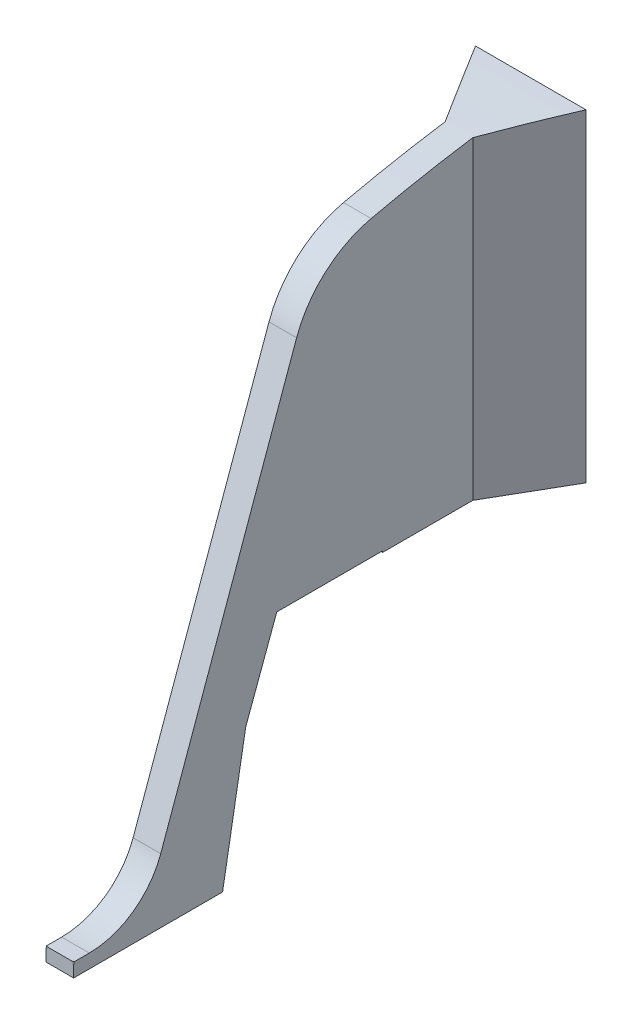
ISO-10303-21;
HEADER;
FILE_DESCRIPTION(('STEP AP214'),'2;1');
FILE_NAME('part.step','',(''),(''),'','','');
FILE_SCHEMA(('AUTOMOTIVE_DESIGN { 1 0 10303 214 1 1 1 1 }'));
ENDSEC;
DATA;
#1=APPLICATION_CONTEXT('core data for automotive mechanical design processes');
#2=APPLICATION_PROTOCOL_DEFINITION('international standard','automotive_design',2000,#1);
#3=PRODUCT_CONTEXT('',#1,'mechanical');
#4=PRODUCT('Part','Part','',(#3));
#5=PRODUCT_RELATED_PRODUCT_CATEGORY('part','',(#4));
#6=PRODUCT_DEFINITION_FORMATION('','',#4);
#7=PRODUCT_DEFINITION_CONTEXT('part definition',#1,'design');
#8=PRODUCT_DEFINITION('design','',#6,#7);
#9=PRODUCT_DEFINITION_SHAPE('','',#8);
#10=(LENGTH_UNIT() NAMED_UNIT(*) SI_UNIT(.MILLI.,.METRE.));
#11=(NAMED_UNIT(*) PLANE_ANGLE_UNIT() SI_UNIT($,.RADIAN.));
#12=(NAMED_UNIT(*) SI_UNIT($,.STERADIAN.) SOLID_ANGLE_UNIT());
#13=UNCERTAINTY_MEASURE_WITH_UNIT(LENGTH_MEASURE(1.E-05),#10,'distance_accuracy_value','');
#14=(GEOMETRIC_REPRESENTATION_CONTEXT(3) GLOBAL_UNCERTAINTY_ASSIGNED_CONTEXT((#13)) GLOBAL_UNIT_ASSIGNED_CONTEXT((#10,
#11,#12)) REPRESENTATION_CONTEXT('',''));
#15=CARTESIAN_POINT('',(0.,0.,0.));
#16=DIRECTION('',(0.,0.,1.));
#17=DIRECTION('',(1.,0.,0.));
#18=AXIS2_PLACEMENT_3D('',#15,#16,#17);
#19=CARTESIAN_POINT('',(0.,8.9916,-2.667));
#20=DIRECTION('',(0.,-1.,0.));
#21=DIRECTION('',(0.,0.,-1.));
#22=AXIS2_PLACEMENT_3D('',#19,#20,#21);
#23=PLANE('',#22);
#24=DIRECTION('',(1.,0.,0.));
#25=VECTOR('',#24,1.);
#26=CARTESIAN_POINT('',(2.032,8.9916,3.556));
#27=LINE('',#26,#25);
#28=CARTESIAN_POINT('',(-1.36783186101216,8.9916,3.556));
#29=VERTEX_POINT('',#28);
#30=CARTESIAN_POINT('',(1.36783186101216,8.9916,3.556));
#31=VERTEX_POINT('',#30);
#32=EDGE_CURVE('E154',#29,#31,#27,.T.);
#33=ORIENTED_EDGE('',*,*,#32,.T.);
#34=CARTESIAN_POINT('',(0.,8.9916,0.));
#35=DIRECTION('',(0.,1.,0.));
#36=DIRECTION('',(0.,0.,1.));
#37=AXIS2_PLACEMENT_3D('',#34,#35,#36);
#38=CIRCLE('',#37,3.81);
#39=EDGE_CURVE('E19',#31,#29,#38,.F.);
#40=ORIENTED_EDGE('',*,*,#39,.T.);
#41=EDGE_LOOP('',(#33,#40));
#42=FACE_BOUND('',#41,.T.);
#43=ADVANCED_FACE('F16',(#42),#23,.T.);
#44=CARTESIAN_POINT('',(-5.2534854532805,0.,7.9502));
#45=DIRECTION('',(-0.865492505596659,0.17364817766693,0.469860652905701));
#46=DIRECTION('',(0.47710901083846,0.,0.878844122570519));
#47=AXIS2_PLACEMENT_3D('',#44,#45,#46);
#48=PLANE('',#47);
#49=DIRECTION('',(0.477109010838456,0.,0.878844122570521));
#50=VECTOR('',#49,1.);
#51=CARTESIAN_POINT('',(-0.508,8.89,13.4059660445079));
#52=LINE('',#51,#50);
#53=CARTESIAN_POINT('',(-0.507999999999998,8.89,13.4059660445079));
#54=VERTEX_POINT('',#53);
#55=CARTESIAN_POINT('',(-0.184069073780514,8.89,14.0026531415017));
#56=VERTEX_POINT('',#55);
#57=EDGE_CURVE('E296',#54,#56,#52,.T.);
#58=ORIENTED_EDGE('',*,*,#57,.T.);
#59=DIRECTION('',(-0.102769424793781,-0.979593398079974,0.172728746205387));
#60=VECTOR('',#59,1.);
#61=CARTESIAN_POINT('',(-0.184069073780514,8.89,14.0026531415017));
#62=LINE('',#61,#60);
#63=CARTESIAN_POINT('',(-0.508000000000002,5.80230541189379,14.5470970055724));
#64=VERTEX_POINT('',#63);
#65=EDGE_CURVE('E280',#56,#64,#62,.T.);
#66=ORIENTED_EDGE('',*,*,#65,.T.);
#67=DIRECTION('',(0.,0.937991887197013,-0.346657207558974));
#68=VECTOR('',#67,1.);
#69=CARTESIAN_POINT('',(-0.508,5.80230541189386,14.5470970055724));
#70=LINE('',#69,#68);
#71=EDGE_CURVE('E175',#64,#54,#70,.T.);
#72=ORIENTED_EDGE('',*,*,#71,.T.);
#73=EDGE_LOOP('',(#58,#66,#72));
#74=FACE_BOUND('',#73,.T.);
#75=ADVANCED_FACE('F264',(#74),#48,.F.);
#76=CARTESIAN_POINT('',(0.,1.3594735403899,18.2168598412698));
#77=DIRECTION('',(0.,-1.,0.));
#78=DIRECTION('',(0.,0.,-1.));
#79=AXIS2_PLACEMENT_3D('',#76,#77,#78);
#80=CONICAL_SURFACE('',#79,2.71006909272842,0.131248759792576);
#81=DIRECTION('',(0.,-0.991088406344877,0.133205746155233));
#82=VECTOR('',#81,1.);
#83=CARTESIAN_POINT('',(-0.508,1.47320000000001,20.8636058877312));
#84=LINE('',#83,#82);
#85=CARTESIAN_POINT('',(-0.508000000000001,1.47320000001042,20.8636058877282));
#86=VERTEX_POINT('',#85);
#87=CARTESIAN_POINT('',(-0.508000000000152,1.36015150960897,20.8788000000008));
#88=VERTEX_POINT('',#87);
#89=EDGE_CURVE('E205',#86,#88,#84,.T.);
#90=ORIENTED_EDGE('',*,*,#89,.T.);
#91=CARTESIAN_POINT('',(-0.421192623152583,1.47319999999959,20.8787999999969));
#92=CARTESIAN_POINT('',(-0.424833261895551,1.46888980748596,20.8787999997683));
#93=CARTESIAN_POINT('',(-0.428447059932461,1.46455699517089,20.8787999972795));
#94=CARTESIAN_POINT('',(-0.435676024984153,1.45578400353945,20.8787999903986));
#95=CARTESIAN_POINT('',(-0.439290416507706,1.45134318508417,20.8787999859787));
#96=CARTESIAN_POINT('',(-0.446520683662248,1.44235420130915,20.8787999779605));
#97=CARTESIAN_POINT('',(-0.450135792289363,1.43780541935201,20.8787999743753));
#98=CARTESIAN_POINT('',(-0.457367588337512,1.42860047511374,20.878799969416));
#99=CARTESIAN_POINT('',(-0.460983517579383,1.42394371733813,20.8787999680753));
#100=CARTESIAN_POINT('',(-0.46821705433114,1.41452280412285,20.8787999681024));
#101=CARTESIAN_POINT('',(-0.471833913115426,1.40975807398956,20.8787999695101));
#102=CARTESIAN_POINT('',(-0.479069404488493,1.40012119223927,20.8787999745102));
#103=CARTESIAN_POINT('',(-0.482687298225334,1.39524848603227,20.878799978134));
#104=CARTESIAN_POINT('',(-0.489924960875009,1.38539564152899,20.8787999861237));
#105=CARTESIAN_POINT('',(-0.493544001299622,1.38041496832405,20.8787999904995));
#106=CARTESIAN_POINT('',(-0.50078403412503,1.37034613564618,20.8787999973863));
#107=CARTESIAN_POINT('',(-0.504404308385084,1.36525745969481,20.8787999998696));
#108=CARTESIAN_POINT('',(-0.508000000000305,1.36015150960909,20.8788000000016));
#109=B_SPLINE_CURVE_WITH_KNOTS('',3,(#91,#92,#93,#94,#95,#96,#97,#98,#99,#100,#101,#102,#103,
#104,#105,#106,#107,#108),.UNSPECIFIED.,.F.,.F.,(4,2,2,2,2,2,2,2,4),(0.,0.0169257929381852,
0.0341027576133717,0.0515334968768953,0.0692205010688216,0.0871661533804649,0.105372734983047,
0.123842429926147,0.142577329810867),.UNSPECIFIED.);
#110=CARTESIAN_POINT('',(-0.421192623133787,1.47320000001021,20.8787999999984));
#111=VERTEX_POINT('',#110);
#112=EDGE_CURVE('E267',#88,#111,#109,.F.);
#113=ORIENTED_EDGE('',*,*,#112,.T.);
#114=CARTESIAN_POINT('',(0.,1.47320000002082,18.2168598412698));
#115=DIRECTION('',(0.,-1.,0.));
#116=DIRECTION('',(0.,0.,-1.));
#117=AXIS2_PLACEMENT_3D('',#114,#115,#116);
#118=CIRCLE('',#117,2.69505633232905);
#119=EDGE_CURVE('E200',#111,#86,#118,.T.);
#120=ORIENTED_EDGE('',*,*,#119,.T.);
#121=EDGE_LOOP('',(#90,#113,#120));
#122=FACE_BOUND('',#121,.T.);
#123=ADVANCED_FACE('F261',(#122),#80,.T.);
#124=CARTESIAN_POINT('',(2.032,25.4,3.556));
#125=DIRECTION('',(0.,0.,1.));
#126=DIRECTION('',(1.,0.,0.));
#127=AXIS2_PLACEMENT_3D('',#124,#125,#126);
#128=PLANE('',#127);
#129=DIRECTION('',(0.,1.,0.));
#130=VECTOR('',#129,1.);
#131=CARTESIAN_POINT('',(-2.032,25.4,3.556));
#132=LINE('',#131,#130);
#133=CARTESIAN_POINT('',(-2.032,8.8392,3.556));
#134=VERTEX_POINT('',#133);
#135=CARTESIAN_POINT('',(-2.032,20.7249512524593,3.55600000000001));
#136=VERTEX_POINT('',#135);
#137=EDGE_CURVE('E169',#134,#136,#132,.T.);
#138=ORIENTED_EDGE('',*,*,#137,.T.);
#139=DIRECTION('',(1.,0.,0.));
#140=VECTOR('',#139,1.);
#141=CARTESIAN_POINT('',(24.003,20.7249512524593,3.55600000000001));
#142=LINE('',#141,#140);
#143=CARTESIAN_POINT('',(2.03199999999999,20.7249512524593,3.55600000000001));
#144=VERTEX_POINT('',#143);
#145=EDGE_CURVE('E332',#144,#136,#142,.F.);
#146=ORIENTED_EDGE('',*,*,#145,.F.);
#147=DIRECTION('',(0.,1.,0.));
#148=VECTOR('',#147,1.);
#149=CARTESIAN_POINT('',(2.03199999999999,25.4,3.556));
#150=LINE('',#149,#148);
#151=CARTESIAN_POINT('',(2.032,8.8392,3.556));
#152=VERTEX_POINT('',#151);
#153=EDGE_CURVE('E325',#144,#152,#150,.F.);
#154=ORIENTED_EDGE('',*,*,#153,.T.);
#155=DIRECTION('',(1.,0.,0.));
#156=VECTOR('',#155,1.);
#157=CARTESIAN_POINT('',(2.032,8.8392,3.556));
#158=LINE('',#157,#156);
#159=CARTESIAN_POINT('',(1.36783186101216,8.8392,3.556));
#160=VERTEX_POINT('',#159);
#161=EDGE_CURVE('E161',#160,#152,#158,.T.);
#162=ORIENTED_EDGE('',*,*,#161,.F.);
#163=DIRECTION('',(0.,1.,0.));
#164=VECTOR('',#163,1.);
#165=CARTESIAN_POINT('',(1.36783186101217,0.,3.556));
#166=LINE('',#165,#164);
#167=EDGE_CURVE('E159',#160,#31,#166,.T.);
#168=ORIENTED_EDGE('',*,*,#167,.T.);
#169=ORIENTED_EDGE('',*,*,#32,.F.);
#170=DIRECTION('',(0.,1.,0.));
#171=VECTOR('',#170,1.);
#172=CARTESIAN_POINT('',(-1.36783186101216,0.,3.556));
#173=LINE('',#172,#171);
#174=CARTESIAN_POINT('',(-1.36783186101216,8.8392,3.556));
#175=VERTEX_POINT('',#174);
#176=EDGE_CURVE('E157',#29,#175,#173,.F.);
#177=ORIENTED_EDGE('',*,*,#176,.T.);
#178=DIRECTION('',(1.,0.,0.));
#179=VECTOR('',#178,1.);
#180=CARTESIAN_POINT('',(2.032,8.8392,3.556));
#181=LINE('',#180,#179);
#182=EDGE_CURVE('E190',#134,#175,#181,.T.);
#183=ORIENTED_EDGE('',*,*,#182,.F.);
#184=EDGE_LOOP('',(#138,#146,#154,#162,#168,#169,#177,#183));
#185=FACE_BOUND('',#184,.T.);
#186=ADVANCED_FACE('F156',(#185),#128,.F.);
#187=CARTESIAN_POINT('',(-0.508,25.4,6.19564543073503));
#188=DIRECTION('',(1.,0.,0.));
#189=DIRECTION('',(0.,0.,-1.));
#190=AXIS2_PLACEMENT_3D('',#187,#188,#189);
#191=PLANE('',#190);
#192=DIRECTION('',(0.,0.984807753012208,0.17364817766693));
#193=VECTOR('',#192,1.);
#194=CARTESIAN_POINT('',(-0.508,0.,7.9502));
#195=LINE('',#194,#193);
#196=CARTESIAN_POINT('',(-0.508,8.8392,9.50878944787827));
#197=VERTEX_POINT('',#196);
#198=CARTESIAN_POINT('',(-0.508,8.89,9.51774685849825));
#199=VERTEX_POINT('',#198);
#200=EDGE_CURVE('E304',#197,#199,#195,.T.);
#201=ORIENTED_EDGE('',*,*,#200,.T.);
#202=DIRECTION('',(0.,0.,1.));
#203=VECTOR('',#202,1.);
#204=CARTESIAN_POINT('',(-0.508,8.89,0.));
#205=LINE('',#204,#203);
#206=EDGE_CURVE('E299',#199,#54,#205,.T.);
#207=ORIENTED_EDGE('',*,*,#206,.T.);
#208=ORIENTED_EDGE('',*,*,#71,.F.);
#209=DIRECTION('',(0.,-0.984807753012208,0.17364817766693));
#210=VECTOR('',#209,1.);
#211=CARTESIAN_POINT('',(-0.508,0.,15.5702));
#212=LINE('',#211,#210);
#213=CARTESIAN_POINT('',(-0.508000000000002,0.965200000000001,15.4000091982202));
#214=VERTEX_POINT('',#213);
#215=EDGE_CURVE('E272',#64,#214,#212,.T.);
#216=ORIENTED_EDGE('',*,*,#215,.T.);
#217=DIRECTION('',(0.,0.,-1.));
#218=VECTOR('',#217,1.);
#219=CARTESIAN_POINT('',(-0.508000000000003,0.9652,12.7));
#220=LINE('',#219,#218);
#221=CARTESIAN_POINT('',(-0.508000000000002,0.9652,20.8788));
#222=VERTEX_POINT('',#221);
#223=EDGE_CURVE('E211',#222,#214,#220,.T.);
#224=ORIENTED_EDGE('',*,*,#223,.F.);
#225=DIRECTION('',(0.,1.,0.));
#226=VECTOR('',#225,1.);
#227=CARTESIAN_POINT('',(-0.508000000000002,1.4732,20.8788));
#228=LINE('',#227,#226);
#229=EDGE_CURVE('E270',#222,#88,#228,.T.);
#230=ORIENTED_EDGE('',*,*,#229,.T.);
#231=ORIENTED_EDGE('',*,*,#89,.F.);
#232=DIRECTION('',(0.,0.,-1.));
#233=VECTOR('',#232,1.);
#234=CARTESIAN_POINT('',(-0.508000000000002,1.4732,20.3049377963588));
#235=LINE('',#234,#233);
#236=CARTESIAN_POINT('',(-0.508000000000002,1.4732,20.3049377963588));
#237=VERTEX_POINT('',#236);
#238=EDGE_CURVE('E197',#86,#237,#235,.T.);
#239=ORIENTED_EDGE('',*,*,#238,.T.);
#240=CARTESIAN_POINT('',(-0.508000000000002,4.2672,20.3049377963588));
#241=DIRECTION('',(1.,0.,0.));
#242=DIRECTION('',(0.,0.,-1.));
#243=AXIS2_PLACEMENT_3D('',#240,#241,#242);
#244=CIRCLE('',#243,2.794);
#245=CARTESIAN_POINT('',(-0.508000000000002,3.32389155345704,17.674993847397));
#246=VERTEX_POINT('',#245);
#247=EDGE_CURVE('E196',#237,#246,#244,.T.);
#248=ORIENTED_EDGE('',*,*,#247,.T.);
#249=DIRECTION('',(0.,0.941282730480238,-0.337619343787746));
#250=VECTOR('',#249,1.);
#251=CARTESIAN_POINT('',(-0.508000000000002,17.2597538689307,12.6764779523204));
#252=LINE('',#251,#250);
#253=CARTESIAN_POINT('',(-0.508000000000002,17.2597538689307,12.6764779523204));
#254=VERTEX_POINT('',#253);
#255=EDGE_CURVE('E193',#246,#254,#252,.T.);
#256=ORIENTED_EDGE('',*,*,#255,.T.);
#257=CARTESIAN_POINT('',(-0.508000000000002,15.9734241690993,9.0901907491907));
#258=DIRECTION('',(1.,0.,0.));
#259=DIRECTION('',(0.,0.,-1.));
#260=AXIS2_PLACEMENT_3D('',#257,#258,#259);
#261=CIRCLE('',#260,3.81);
#262=CARTESIAN_POINT('',(-0.508000000000002,19.6885401738103,9.93518369090162));
#263=VERTEX_POINT('',#262);
#264=EDGE_CURVE('E333',#263,#254,#261,.T.);
#265=ORIENTED_EDGE('',*,*,#264,.F.);
#266=CARTESIAN_POINT('',(-0.508000000000002,-30.6931785714284,-1.52400000000002));
#267=DIRECTION('',(1.,0.,0.));
#268=DIRECTION('',(0.,0.,-1.));
#269=AXIS2_PLACEMENT_3D('',#266,#267,#268);
#270=CIRCLE('',#269,51.6684669269969);
#271=CARTESIAN_POINT('',(-0.508000000000002,20.3953480173264,6.19564543073504));
#272=VERTEX_POINT('',#271);
#273=EDGE_CURVE('E326',#272,#263,#270,.T.);
#274=ORIENTED_EDGE('',*,*,#273,.F.);
#275=DIRECTION('',(0.,1.,0.));
#276=VECTOR('',#275,1.);
#277=CARTESIAN_POINT('',(-0.508000000000005,25.4,6.19564543073503));
#278=LINE('',#277,#276);
#279=CARTESIAN_POINT('',(-0.508000000000002,8.8392,6.19564543073503));
#280=VERTEX_POINT('',#279);
#281=EDGE_CURVE('E167',#272,#280,#278,.F.);
#282=ORIENTED_EDGE('',*,*,#281,.T.);
#283=DIRECTION('',(0.,0.,-1.));
#284=VECTOR('',#283,1.);
#285=CARTESIAN_POINT('',(-0.508,8.8392,0.));
#286=LINE('',#285,#284);
#287=EDGE_CURVE('E186',#197,#280,#286,.T.);
#288=ORIENTED_EDGE('',*,*,#287,.F.);
#289=EDGE_LOOP('',(#201,#207,#208,#216,#224,#230,#231,#239,#248,#256,#265,#274,#282,#288));
#290=FACE_BOUND('',#289,.T.);
#291=ADVANCED_FACE('F255',(#290),#191,.F.);
#292=CARTESIAN_POINT('',(-2.032,25.4,3.556));
#293=DIRECTION('',(0.866025403784445,0.,-0.49999999999999));
#294=DIRECTION('',(-0.49999999999999,0.,-0.866025403784445));
#295=AXIS2_PLACEMENT_3D('',#292,#293,#294);
#296=PLANE('',#295);
#297=ORIENTED_EDGE('',*,*,#281,.F.);
#298=CARTESIAN_POINT('',(-4.96493936748323,-30.6931785714284,-1.52400000000002));
#299=DIRECTION('',(0.866025403784445,0.,-0.49999999999999));
#300=DIRECTION('',(0.49999999999999,0.,0.866025403784445));
#301=AXIS2_PLACEMENT_3D('',#298,#299,#300);
#302=ELLIPSE('',#301,59.6616065778334,51.6684669269969);
#303=EDGE_CURVE('E329',#136,#272,#302,.T.);
#304=ORIENTED_EDGE('',*,*,#303,.F.);
#305=ORIENTED_EDGE('',*,*,#137,.F.);
#306=DIRECTION('',(-0.499999999999991,0.,-0.866025403784444));
#307=VECTOR('',#306,1.);
#308=CARTESIAN_POINT('',(-0.508,8.8392,6.19564543073503));
#309=LINE('',#308,#307);
#310=EDGE_CURVE('E183',#280,#134,#309,.T.);
#311=ORIENTED_EDGE('',*,*,#310,.F.);
#312=EDGE_LOOP('',(#297,#304,#305,#311));
#313=FACE_BOUND('',#312,.T.);
#314=ADVANCED_FACE('F252',(#313),#296,.F.);
#315=CARTESIAN_POINT('',(0.,0.,0.));
#316=DIRECTION('',(0.,1.,0.));
#317=DIRECTION('',(0.,0.,1.));
#318=AXIS2_PLACEMENT_3D('',#315,#316,#317);
#319=CYLINDRICAL_SURFACE('',#318,3.81);
#320=CARTESIAN_POINT('',(0.,8.8392,0.));
#321=DIRECTION('',(0.,1.,0.));
#322=DIRECTION('',(0.,0.,1.));
#323=AXIS2_PLACEMENT_3D('',#320,#321,#322);
#324=CIRCLE('',#323,3.81);
#325=EDGE_CURVE('E165',#175,#160,#324,.T.);
#326=ORIENTED_EDGE('',*,*,#325,.F.);
#327=ORIENTED_EDGE('',*,*,#176,.F.);
#328=ORIENTED_EDGE('',*,*,#39,.F.);
#329=ORIENTED_EDGE('',*,*,#167,.F.);
#330=EDGE_LOOP('',(#326,#327,#328,#329));
#331=FACE_BOUND('',#330,.T.);
#332=ADVANCED_FACE('F163',(#331),#319,.F.);
#333=CARTESIAN_POINT('',(5.2534854532805,0.,7.9502));
#334=DIRECTION('',(0.,0.17364817766693,-0.984807753012208));
#335=DIRECTION('',(0.,0.984807753012208,0.17364817766693));
#336=AXIS2_PLACEMENT_3D('',#333,#334,#335);
#337=PLANE('',#336);
#338=DIRECTION('',(1.,0.,0.));
#339=VECTOR('',#338,1.);
#340=CARTESIAN_POINT('',(2.54,8.8392,9.50878944787827));
#341=LINE('',#340,#339);
#342=CARTESIAN_POINT('',(0.508,8.8392,9.50878944787827));
#343=VERTEX_POINT('',#342);
#344=EDGE_CURVE('E375',#343,#197,#341,.F.);
#345=ORIENTED_EDGE('',*,*,#344,.F.);
#346=DIRECTION('',(0.,0.984807753012197,0.173648177666991));
#347=VECTOR('',#346,1.);
#348=CARTESIAN_POINT('',(0.508,8.8392,9.50878944787827));
#349=LINE('',#348,#347);
#350=CARTESIAN_POINT('',(0.508,8.89,9.51774685849826));
#351=VERTEX_POINT('',#350);
#352=EDGE_CURVE('E424',#343,#351,#349,.T.);
#353=ORIENTED_EDGE('',*,*,#352,.T.);
#354=DIRECTION('',(1.,0.,0.));
#355=VECTOR('',#354,1.);
#356=CARTESIAN_POINT('',(0.,8.89,9.51774685849826));
#357=LINE('',#356,#355);
#358=EDGE_CURVE('E298',#351,#199,#357,.F.);
#359=ORIENTED_EDGE('',*,*,#358,.T.);
#360=ORIENTED_EDGE('',*,*,#200,.F.);
#361=EDGE_LOOP('',(#345,#353,#359,#360));
#362=FACE_BOUND('',#361,.T.);
#363=ADVANCED_FACE('F245',(#362),#337,.F.);
#364=CARTESIAN_POINT('',(0.,8.89,0.));
#365=DIRECTION('',(0.,1.,0.));
#366=DIRECTION('',(0.,0.,1.));
#367=AXIS2_PLACEMENT_3D('',#364,#365,#366);
#368=PLANE('',#367);
#369=DIRECTION('',(0.,0.,1.));
#370=VECTOR('',#369,1.);
#371=CARTESIAN_POINT('',(0.508,8.89,28.956));
#372=LINE('',#371,#370);
#373=CARTESIAN_POINT('',(0.508000000000002,8.89,13.4059660445079));
#374=VERTEX_POINT('',#373);
#375=EDGE_CURVE('E416',#351,#374,#372,.T.);
#376=ORIENTED_EDGE('',*,*,#375,.T.);
#377=DIRECTION('',(0.47710901083846,0.,-0.878844122570519));
#378=VECTOR('',#377,1.);
#379=CARTESIAN_POINT('',(-0.260907815894011,8.89,14.822309268899));
#380=LINE('',#379,#378);
#381=CARTESIAN_POINT('',(0.184069073780515,8.89,14.0026531415017));
#382=VERTEX_POINT('',#381);
#383=EDGE_CURVE('E411',#374,#382,#380,.F.);
#384=ORIENTED_EDGE('',*,*,#383,.T.);
#385=DIRECTION('',(1.,0.,0.));
#386=VECTOR('',#385,1.);
#387=CARTESIAN_POINT('',(-1.11672152755106,8.89,14.0026531415017));
#388=LINE('',#387,#386);
#389=EDGE_CURVE('E288',#382,#56,#388,.F.);
#390=ORIENTED_EDGE('',*,*,#389,.T.);
#391=ORIENTED_EDGE('',*,*,#57,.F.);
#392=ORIENTED_EDGE('',*,*,#206,.F.);
#393=ORIENTED_EDGE('',*,*,#358,.F.);
#394=EDGE_LOOP('',(#376,#384,#390,#391,#392,#393));
#395=FACE_BOUND('',#394,.T.);
#396=ADVANCED_FACE('F241',(#395),#368,.F.);
#397=CARTESIAN_POINT('',(1.11672152755106,0.,15.5702));
#398=DIRECTION('',(0.865492505596659,0.17364817766693,0.469860652905701));
#399=DIRECTION('',(0.47710901083846,0.,-0.878844122570519));
#400=AXIS2_PLACEMENT_3D('',#397,#398,#399);
#401=PLANE('',#400);
#402=DIRECTION('',(-0.102769424793781,0.979593398079974,-0.172728746205387));
#403=VECTOR('',#402,1.);
#404=CARTESIAN_POINT('',(0.508,5.80230541189383,14.5470970055724));
#405=LINE('',#404,#403);
#406=CARTESIAN_POINT('',(0.508000000000001,5.80230541189381,14.5470970055724));
#407=VERTEX_POINT('',#406);
#408=EDGE_CURVE('E293',#407,#382,#405,.T.);
#409=ORIENTED_EDGE('',*,*,#408,.T.);
#410=ORIENTED_EDGE('',*,*,#383,.F.);
#411=DIRECTION('',(0.,-0.937991887197014,0.346657207558972));
#412=VECTOR('',#411,1.);
#413=CARTESIAN_POINT('',(0.508,8.89,13.4059660445079));
#414=LINE('',#413,#412);
#415=EDGE_CURVE('E406',#374,#407,#414,.T.);
#416=ORIENTED_EDGE('',*,*,#415,.T.);
#417=EDGE_LOOP('',(#409,#410,#416));
#418=FACE_BOUND('',#417,.T.);
#419=ADVANCED_FACE('F237',(#418),#401,.F.);
#420=CARTESIAN_POINT('',(-1.11672152755106,0.,15.5702));
#421=DIRECTION('',(0.,0.17364817766693,0.984807753012208));
#422=DIRECTION('',(0.,-0.984807753012208,0.17364817766693));
#423=AXIS2_PLACEMENT_3D('',#420,#421,#422);
#424=PLANE('',#423);
#425=DIRECTION('',(1.,0.,0.));
#426=VECTOR('',#425,1.);
#427=CARTESIAN_POINT('',(2.54,0.9652,15.4000091982202));
#428=LINE('',#427,#426);
#429=CARTESIAN_POINT('',(0.508,0.9652,15.4000091982202));
#430=VERTEX_POINT('',#429);
#431=EDGE_CURVE('E389',#214,#430,#428,.T.);
#432=ORIENTED_EDGE('',*,*,#431,.F.);
#433=ORIENTED_EDGE('',*,*,#215,.F.);
#434=ORIENTED_EDGE('',*,*,#65,.F.);
#435=ORIENTED_EDGE('',*,*,#389,.F.);
#436=ORIENTED_EDGE('',*,*,#408,.F.);
#437=DIRECTION('',(0.,-0.984807753012208,0.173648177666932));
#438=VECTOR('',#437,1.);
#439=CARTESIAN_POINT('',(0.508,5.80230541189383,14.5470970055724));
#440=LINE('',#439,#438);
#441=EDGE_CURVE('E398',#407,#430,#440,.T.);
#442=ORIENTED_EDGE('',*,*,#441,.T.);
#443=EDGE_LOOP('',(#432,#433,#434,#435,#436,#442));
#444=FACE_BOUND('',#443,.T.);
#445=ADVANCED_FACE('F233',(#444),#424,.F.);
#446=CARTESIAN_POINT('',(2.54,0.9652,12.7));
#447=DIRECTION('',(0.,-1.,0.));
#448=DIRECTION('',(0.,0.,-1.));
#449=AXIS2_PLACEMENT_3D('',#446,#447,#448);
#450=PLANE('',#449);
#451=ORIENTED_EDGE('',*,*,#223,.T.);
#452=ORIENTED_EDGE('',*,*,#431,.T.);
#453=DIRECTION('',(0.,0.,1.));
#454=VECTOR('',#453,1.);
#455=CARTESIAN_POINT('',(0.508,0.965199999999999,28.956));
#456=LINE('',#455,#454);
#457=CARTESIAN_POINT('',(0.508000000000001,0.9652,20.8788));
#458=VERTEX_POINT('',#457);
#459=EDGE_CURVE('E385',#430,#458,#456,.T.);
#460=ORIENTED_EDGE('',*,*,#459,.T.);
#461=DIRECTION('',(-1.,0.,0.));
#462=VECTOR('',#461,1.);
#463=CARTESIAN_POINT('',(24.003,0.9652,20.8788));
#464=LINE('',#463,#462);
#465=EDGE_CURVE('E210',#458,#222,#464,.T.);
#466=ORIENTED_EDGE('',*,*,#465,.T.);
#467=EDGE_LOOP('',(#451,#452,#460,#466));
#468=FACE_BOUND('',#467,.T.);
#469=ADVANCED_FACE('F229',(#468),#450,.T.);
#470=CARTESIAN_POINT('',(24.003,1.4732,20.8788));
#471=DIRECTION('',(0.,0.,-1.));
#472=DIRECTION('',(-1.,0.,0.));
#473=AXIS2_PLACEMENT_3D('',#470,#471,#472);
#474=PLANE('',#473);
#475=DIRECTION('',(0.,1.,0.));
#476=VECTOR('',#475,1.);
#477=CARTESIAN_POINT('',(0.508,25.4,20.8788));
#478=LINE('',#477,#476);
#479=CARTESIAN_POINT('',(0.507999999999795,1.36015150961961,20.8787999999989));
#480=VERTEX_POINT('',#479);
#481=EDGE_CURVE('E353',#458,#480,#478,.T.);
#482=ORIENTED_EDGE('',*,*,#481,.T.);
#483=CARTESIAN_POINT('',(0.507999999999591,1.36015150963071,20.8787999999978));
#484=CARTESIAN_POINT('',(0.504404308384407,1.36525745971853,20.8787999998656));
#485=CARTESIAN_POINT('',(0.500784034124272,1.37034613567193,20.8787999973821));
#486=CARTESIAN_POINT('',(0.493544001298722,1.38041496835325,20.878799990495));
#487=CARTESIAN_POINT('',(0.489924960874056,1.38539564155964,20.878799986119));
#488=CARTESIAN_POINT('',(0.482687298224298,1.39524848606522,20.8787999781291));
#489=CARTESIAN_POINT('',(0.479069404487434,1.40012119227309,20.8787999745052));
#490=CARTESIAN_POINT('',(0.471833913114339,1.40975807402451,20.878799969505));
#491=CARTESIAN_POINT('',(0.468217054330055,1.41452280415809,20.8787999680973));
#492=CARTESIAN_POINT('',(0.460983517578323,1.42394371737335,20.8787999680703));
#493=CARTESIAN_POINT('',(0.457367588336483,1.42860047514866,20.8787999694111));
#494=CARTESIAN_POINT('',(0.450135792288413,1.43780541938575,20.8787999743706));
#495=CARTESIAN_POINT('',(0.446520683661353,1.44235420134201,20.878799977956));
#496=CARTESIAN_POINT('',(0.43929041650694,1.45134318511468,20.8787999859746));
#497=CARTESIAN_POINT('',(0.435676024983468,1.45578400356851,20.8787999903947));
#498=CARTESIAN_POINT('',(0.428447059931954,1.46455699519644,20.8787999972761));
#499=CARTESIAN_POINT('',(0.424833261895149,1.46888980750947,20.8787999997652));
#500=CARTESIAN_POINT('',(0.421192623152142,1.47320000002093,20.8787999999941));
#501=B_SPLINE_CURVE_WITH_KNOTS('',3,(#483,#484,#485,#486,#487,#488,#489,#490,#491,#492,#493,
#494,#495,#496,#497,#498,#499,#500),.UNSPECIFIED.,.F.,.F.,(4,2,2,2,2,2,2,2,4),(0.,
0.0187348998898067,0.0372045948364989,0.0554111764411986,0.0733568287535085,0.0910438329446692,
0.108474572206022,0.125651536877657,0.142577329810939),.UNSPECIFIED.);
#502=CARTESIAN_POINT('',(0.421192623133567,1.47320000002088,20.8787999999971));
#503=VERTEX_POINT('',#502);
#504=EDGE_CURVE('E204',#503,#480,#501,.F.);
#505=ORIENTED_EDGE('',*,*,#504,.F.);
#506=DIRECTION('',(1.,0.,0.));
#507=VECTOR('',#506,1.);
#508=CARTESIAN_POINT('',(24.003,1.4732,20.8788));
#509=LINE('',#508,#507);
#510=EDGE_CURVE('E201',#503,#111,#509,.F.);
#511=ORIENTED_EDGE('',*,*,#510,.T.);
#512=ORIENTED_EDGE('',*,*,#112,.F.);
#513=ORIENTED_EDGE('',*,*,#229,.F.);
#514=ORIENTED_EDGE('',*,*,#465,.F.);
#515=EDGE_LOOP('',(#482,#505,#511,#512,#513,#514));
#516=FACE_BOUND('',#515,.T.);
#517=ADVANCED_FACE('F224',(#516),#474,.F.);
#518=CARTESIAN_POINT('',(0.,1.35947321882668,18.2168598412698));
#519=DIRECTION('',(0.,-1.,0.));
#520=DIRECTION('',(0.,0.,-1.));
#521=AXIS2_PLACEMENT_3D('',#518,#519,#520);
#522=CONICAL_SURFACE('',#521,2.71006913517624,0.131248759784145);
#523=DIRECTION('',(0.,0.991088406344933,-0.133205746154815));
#524=VECTOR('',#523,1.);
#525=CARTESIAN_POINT('',(0.508,1.36015150960852,20.8788));
#526=LINE('',#525,#524);
#527=CARTESIAN_POINT('',(0.508,1.47320000001042,20.8636058877282));
#528=VERTEX_POINT('',#527);
#529=EDGE_CURVE('E356',#480,#528,#526,.T.);
#530=ORIENTED_EDGE('',*,*,#529,.T.);
#531=CARTESIAN_POINT('',(0.,1.47320000002082,18.2168598412698));
#532=DIRECTION('',(0.,-1.,0.));
#533=DIRECTION('',(0.,0.,-1.));
#534=AXIS2_PLACEMENT_3D('',#531,#532,#533);
#535=CIRCLE('',#534,2.69505633232905);
#536=EDGE_CURVE('E199',#528,#503,#535,.T.);
#537=ORIENTED_EDGE('',*,*,#536,.T.);
#538=ORIENTED_EDGE('',*,*,#504,.T.);
#539=EDGE_LOOP('',(#530,#537,#538));
#540=FACE_BOUND('',#539,.T.);
#541=ADVANCED_FACE('F213',(#540),#522,.T.);
#542=CARTESIAN_POINT('',(24.003,1.4732,20.3049377963588));
#543=DIRECTION('',(0.,-1.,0.));
#544=DIRECTION('',(0.,0.,-1.));
#545=AXIS2_PLACEMENT_3D('',#542,#543,#544);
#546=PLANE('',#545);
#547=DIRECTION('',(0.,0.,1.));
#548=VECTOR('',#547,1.);
#549=CARTESIAN_POINT('',(0.508,1.47320000000001,28.956));
#550=LINE('',#549,#548);
#551=CARTESIAN_POINT('',(0.508000000000002,1.47320000000001,20.3049377963588));
#552=VERTEX_POINT('',#551);
#553=EDGE_CURVE('E320',#528,#552,#550,.F.);
#554=ORIENTED_EDGE('',*,*,#553,.T.);
#555=DIRECTION('',(1.,0.,0.));
#556=VECTOR('',#555,1.);
#557=CARTESIAN_POINT('',(24.003,1.4732,20.3049377963588));
#558=LINE('',#557,#556);
#559=EDGE_CURVE('E340',#552,#237,#558,.F.);
#560=ORIENTED_EDGE('',*,*,#559,.T.);
#561=ORIENTED_EDGE('',*,*,#238,.F.);
#562=ORIENTED_EDGE('',*,*,#119,.F.);
#563=ORIENTED_EDGE('',*,*,#510,.F.);
#564=ORIENTED_EDGE('',*,*,#536,.F.);
#565=EDGE_LOOP('',(#554,#560,#561,#562,#563,#564));
#566=FACE_BOUND('',#565,.T.);
#567=ADVANCED_FACE('F223',(#566),#546,.F.);
#568=CARTESIAN_POINT('',(24.003,4.2672,20.3049377963588));
#569=DIRECTION('',(1.,0.,0.));
#570=DIRECTION('',(0.,0.,-1.));
#571=AXIS2_PLACEMENT_3D('',#568,#569,#570);
#572=CYLINDRICAL_SURFACE('',#571,2.794);
#573=DIRECTION('',(1.,0.,0.));
#574=VECTOR('',#573,1.);
#575=CARTESIAN_POINT('',(24.003,3.32389155345703,17.674993847397));
#576=LINE('',#575,#574);
#577=CARTESIAN_POINT('',(0.508000000000002,3.32389155345704,17.674993847397));
#578=VERTEX_POINT('',#577);
#579=EDGE_CURVE('E195',#578,#246,#576,.F.);
#580=ORIENTED_EDGE('',*,*,#579,.T.);
#581=ORIENTED_EDGE('',*,*,#247,.F.);
#582=ORIENTED_EDGE('',*,*,#559,.F.);
#583=CARTESIAN_POINT('',(0.508000000000002,4.2672,20.3049377963588));
#584=DIRECTION('',(1.,0.,0.));
#585=DIRECTION('',(0.,0.,-1.));
#586=AXIS2_PLACEMENT_3D('',#583,#584,#585);
#587=CIRCLE('',#586,2.794);
#588=EDGE_CURVE('E317',#552,#578,#587,.T.);
#589=ORIENTED_EDGE('',*,*,#588,.T.);
#590=EDGE_LOOP('',(#580,#581,#582,#589));
#591=FACE_BOUND('',#590,.T.);
#592=ADVANCED_FACE('F461',(#591),#572,.F.);
#593=CARTESIAN_POINT('',(24.003,17.2597538689307,12.6764779523204));
#594=DIRECTION('',(0.,-0.337619343787746,-0.941282730480238));
#595=DIRECTION('',(0.,0.941282730480238,-0.337619343787746));
#596=AXIS2_PLACEMENT_3D('',#593,#594,#595);
#597=PLANE('',#596);
#598=DIRECTION('',(0.,0.941282730480237,-0.337619343787747));
#599=VECTOR('',#598,1.);
#600=CARTESIAN_POINT('',(0.508,3.32389155345704,17.6749938473971));
#601=LINE('',#600,#599);
#602=CARTESIAN_POINT('',(0.508000000000002,17.2597538689307,12.6764779523204));
#603=VERTEX_POINT('',#602);
#604=EDGE_CURVE('E316',#578,#603,#601,.T.);
#605=ORIENTED_EDGE('',*,*,#604,.T.);
#606=DIRECTION('',(1.,0.,0.));
#607=VECTOR('',#606,1.);
#608=CARTESIAN_POINT('',(24.003,17.2597538689307,12.6764779523204));
#609=LINE('',#608,#607);
#610=EDGE_CURVE('E337',#254,#603,#609,.T.);
#611=ORIENTED_EDGE('',*,*,#610,.F.);
#612=ORIENTED_EDGE('',*,*,#255,.F.);
#613=ORIENTED_EDGE('',*,*,#579,.F.);
#614=EDGE_LOOP('',(#605,#611,#612,#613));
#615=FACE_BOUND('',#614,.T.);
#616=ADVANCED_FACE('F464',(#615),#597,.F.);
#617=CARTESIAN_POINT('',(24.003,15.9734241690993,9.0901907491907));
#618=DIRECTION('',(1.,0.,0.));
#619=DIRECTION('',(0.,0.,-1.));
#620=AXIS2_PLACEMENT_3D('',#617,#618,#619);
#621=CYLINDRICAL_SURFACE('',#620,3.81);
#622=DIRECTION('',(1.,0.,0.));
#623=VECTOR('',#622,1.);
#624=CARTESIAN_POINT('',(24.003,19.6885401738104,9.93518369090165));
#625=LINE('',#624,#623);
#626=CARTESIAN_POINT('',(0.508000000000002,19.6885401738104,9.93518369090165));
#627=VERTEX_POINT('',#626);
#628=EDGE_CURVE('E336',#263,#627,#625,.T.);
#629=ORIENTED_EDGE('',*,*,#628,.F.);
#630=ORIENTED_EDGE('',*,*,#264,.T.);
#631=ORIENTED_EDGE('',*,*,#610,.T.);
#632=CARTESIAN_POINT('',(0.508000000000002,15.9734241690993,9.0901907491907));
#633=DIRECTION('',(1.,0.,0.));
#634=DIRECTION('',(0.,0.,-1.));
#635=AXIS2_PLACEMENT_3D('',#632,#633,#634);
#636=CIRCLE('',#635,3.81);
#637=EDGE_CURVE('E313',#603,#627,#636,.F.);
#638=ORIENTED_EDGE('',*,*,#637,.T.);
#639=EDGE_LOOP('',(#629,#630,#631,#638));
#640=FACE_BOUND('',#639,.T.);
#641=ADVANCED_FACE('F470',(#640),#621,.T.);
#642=CARTESIAN_POINT('',(24.003,-30.6931785714284,-1.52400000000002));
#643=DIRECTION('',(1.,0.,0.));
#644=DIRECTION('',(0.,0.,-1.));
#645=AXIS2_PLACEMENT_3D('',#642,#643,#644);
#646=CYLINDRICAL_SURFACE('',#645,51.6684669269969);
#647=ORIENTED_EDGE('',*,*,#303,.T.);
#648=ORIENTED_EDGE('',*,*,#273,.T.);
#649=ORIENTED_EDGE('',*,*,#628,.T.);
#650=CARTESIAN_POINT('',(0.508000000000002,-30.6931785714284,-1.52400000000002));
#651=DIRECTION('',(1.,0.,0.));
#652=DIRECTION('',(0.,0.,-1.));
#653=AXIS2_PLACEMENT_3D('',#650,#651,#652);
#654=CIRCLE('',#653,51.6684669269969);
#655=CARTESIAN_POINT('',(0.508000000000002,20.3953480173264,6.19564543073503));
#656=VERTEX_POINT('',#655);
#657=EDGE_CURVE('E310',#627,#656,#654,.F.);
#658=ORIENTED_EDGE('',*,*,#657,.T.);
#659=CARTESIAN_POINT('',(4.96493936748322,-30.6931785714284,-1.52400000000002));
#660=DIRECTION('',(-0.866025403784445,0.,-0.49999999999999));
#661=DIRECTION('',(0.49999999999999,0.,-0.866025403784445));
#662=AXIS2_PLACEMENT_3D('',#659,#660,#661);
#663=ELLIPSE('',#662,59.6616065778334,51.6684669269969);
#664=EDGE_CURVE('E322',#656,#144,#663,.T.);
#665=ORIENTED_EDGE('',*,*,#664,.T.);
#666=ORIENTED_EDGE('',*,*,#145,.T.);
#667=EDGE_LOOP('',(#647,#648,#649,#658,#665,#666));
#668=FACE_BOUND('',#667,.T.);
#669=ADVANCED_FACE('F472',(#668),#646,.T.);
#670=CARTESIAN_POINT('',(0.508,25.4,6.19564543073503));
#671=DIRECTION('',(-0.866025403784445,0.,-0.49999999999999));
#672=DIRECTION('',(-0.49999999999999,0.,0.866025403784445));
#673=AXIS2_PLACEMENT_3D('',#670,#671,#672);
#674=PLANE('',#673);
#675=ORIENTED_EDGE('',*,*,#153,.F.);
#676=ORIENTED_EDGE('',*,*,#664,.F.);
#677=DIRECTION('',(0.,1.,0.));
#678=VECTOR('',#677,1.);
#679=CARTESIAN_POINT('',(0.508,25.4,6.19564543073503));
#680=LINE('',#679,#678);
#681=CARTESIAN_POINT('',(0.508,8.8392,6.19564543073503));
#682=VERTEX_POINT('',#681);
#683=EDGE_CURVE('E25',#656,#682,#680,.F.);
#684=ORIENTED_EDGE('',*,*,#683,.T.);
#685=DIRECTION('',(-0.499999999999992,0.,0.866025403784444));
#686=VECTOR('',#685,1.);
#687=CARTESIAN_POINT('',(2.032,8.8392,3.556));
#688=LINE('',#687,#686);
#689=EDGE_CURVE('E33',#152,#682,#688,.T.);
#690=ORIENTED_EDGE('',*,*,#689,.F.);
#691=EDGE_LOOP('',(#675,#676,#684,#690));
#692=FACE_BOUND('',#691,.T.);
#693=ADVANCED_FACE('F478',(#692),#674,.F.);
#694=CARTESIAN_POINT('',(2.54,8.8392,0.));
#695=DIRECTION('',(0.,-1.,0.));
#696=DIRECTION('',(0.,0.,-1.));
#697=AXIS2_PLACEMENT_3D('',#694,#695,#696);
#698=PLANE('',#697);
#699=DIRECTION('',(0.,0.,1.));
#700=VECTOR('',#699,1.);
#701=CARTESIAN_POINT('',(0.508,8.8392,28.956));
#702=LINE('',#701,#700);
#703=EDGE_CURVE('E11',#682,#343,#702,.T.);
#704=ORIENTED_EDGE('',*,*,#703,.T.);
#705=ORIENTED_EDGE('',*,*,#344,.T.);
#706=ORIENTED_EDGE('',*,*,#287,.T.);
#707=ORIENTED_EDGE('',*,*,#310,.T.);
#708=ORIENTED_EDGE('',*,*,#182,.T.);
#709=ORIENTED_EDGE('',*,*,#325,.T.);
#710=ORIENTED_EDGE('',*,*,#161,.T.);
#711=ORIENTED_EDGE('',*,*,#689,.T.);
#712=EDGE_LOOP('',(#704,#705,#706,#707,#708,#709,#710,#711));
#713=FACE_BOUND('',#712,.T.);
#714=ADVANCED_FACE('F445',(#713),#698,.T.);
#715=CARTESIAN_POINT('',(0.508,25.4,28.956));
#716=DIRECTION('',(-1.,0.,0.));
#717=DIRECTION('',(0.,0.,1.));
#718=AXIS2_PLACEMENT_3D('',#715,#716,#717);
#719=PLANE('',#718);
#720=ORIENTED_EDGE('',*,*,#683,.F.);
#721=ORIENTED_EDGE('',*,*,#657,.F.);
#722=ORIENTED_EDGE('',*,*,#637,.F.);
#723=ORIENTED_EDGE('',*,*,#604,.F.);
#724=ORIENTED_EDGE('',*,*,#588,.F.);
#725=ORIENTED_EDGE('',*,*,#553,.F.);
#726=ORIENTED_EDGE('',*,*,#529,.F.);
#727=ORIENTED_EDGE('',*,*,#481,.F.);
#728=ORIENTED_EDGE('',*,*,#459,.F.);
#729=ORIENTED_EDGE('',*,*,#441,.F.);
#730=ORIENTED_EDGE('',*,*,#415,.F.);
#731=ORIENTED_EDGE('',*,*,#375,.F.);
#732=ORIENTED_EDGE('',*,*,#352,.F.);
#733=ORIENTED_EDGE('',*,*,#703,.F.);
#734=EDGE_LOOP('',(#720,#721,#722,#723,#724,#725,#726,#727,#728,#729,#730,#731,#732,#733));
#735=FACE_BOUND('',#734,.T.);
#736=ADVANCED_FACE('F361',(#735),#719,.F.);
#737=CLOSED_SHELL('',(#43,#75,#123,#186,#291,#314,#332,#363,#396,#419,#445,#469,#517,#541,#567,
#592,#616,#641,#669,#693,#714,#736));
#738=MANIFOLD_SOLID_BREP('B1',#737);
#739=ADVANCED_BREP_SHAPE_REPRESENTATION('',(#18,#738),#14);
#740=SHAPE_DEFINITION_REPRESENTATION(#9,#739);
ENDSEC;
END-ISO-10303-21;
